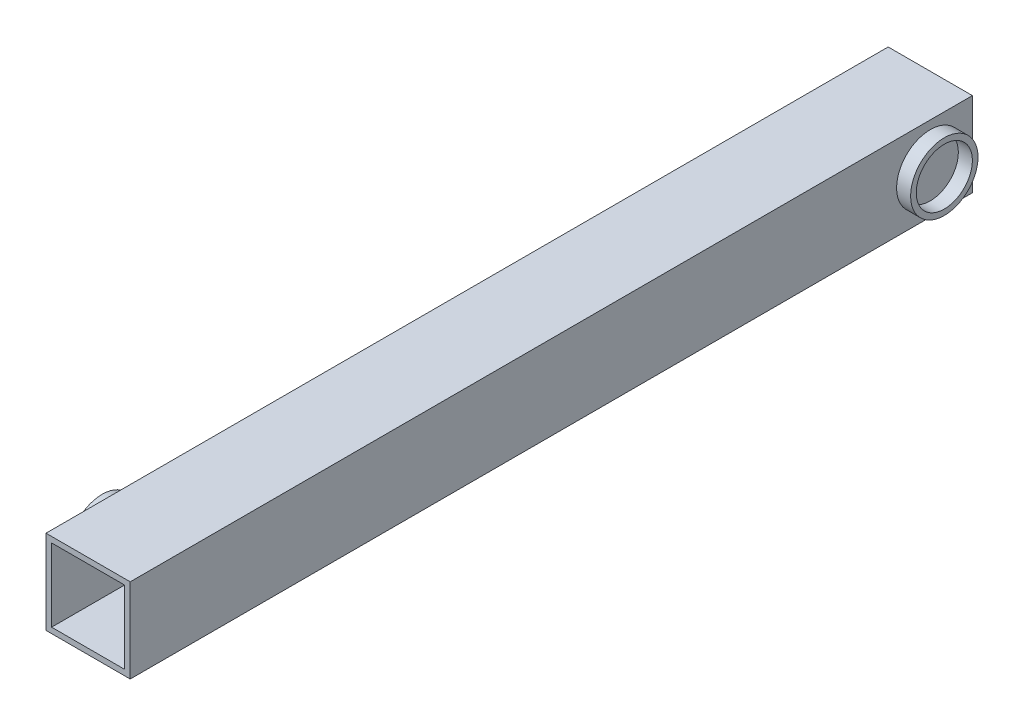
ISO-10303-21;
HEADER;
FILE_DESCRIPTION(('STEP AP214'),'2;1');
FILE_NAME('part.step','',(''),(''),'','','');
FILE_SCHEMA(('AUTOMOTIVE_DESIGN { 1 0 10303 214 1 1 1 1 }'));
ENDSEC;
DATA;
#1=APPLICATION_CONTEXT('core data for automotive mechanical design processes');
#2=APPLICATION_PROTOCOL_DEFINITION('international standard','automotive_design',2000,#1);
#3=PRODUCT_CONTEXT('',#1,'mechanical');
#4=PRODUCT('Part','Part','',(#3));
#5=PRODUCT_RELATED_PRODUCT_CATEGORY('part','',(#4));
#6=PRODUCT_DEFINITION_FORMATION('','',#4);
#7=PRODUCT_DEFINITION_CONTEXT('part definition',#1,'design');
#8=PRODUCT_DEFINITION('design','',#6,#7);
#9=PRODUCT_DEFINITION_SHAPE('','',#8);
#10=(LENGTH_UNIT() NAMED_UNIT(*) SI_UNIT(.MILLI.,.METRE.));
#11=(NAMED_UNIT(*) PLANE_ANGLE_UNIT() SI_UNIT($,.RADIAN.));
#12=(NAMED_UNIT(*) SI_UNIT($,.STERADIAN.) SOLID_ANGLE_UNIT());
#13=UNCERTAINTY_MEASURE_WITH_UNIT(LENGTH_MEASURE(1.E-05),#10,'distance_accuracy_value','');
#14=(GEOMETRIC_REPRESENTATION_CONTEXT(3) GLOBAL_UNCERTAINTY_ASSIGNED_CONTEXT((#13)) GLOBAL_UNIT_ASSIGNED_CONTEXT((#10,
#11,#12)) REPRESENTATION_CONTEXT('',''));
#15=CARTESIAN_POINT('',(0.,0.,0.));
#16=DIRECTION('',(0.,0.,1.));
#17=DIRECTION('',(1.,0.,0.));
#18=AXIS2_PLACEMENT_3D('',#15,#16,#17);
#19=CARTESIAN_POINT('',(0.,0.,300.));
#20=DIRECTION('',(0.,0.,1.));
#21=DIRECTION('',(1.,0.,0.));
#22=AXIS2_PLACEMENT_3D('',#19,#20,#21);
#23=PLANE('',#22);
#24=DIRECTION('',(0.,1.,0.));
#25=VECTOR('',#24,1.);
#26=CARTESIAN_POINT('',(15.,15.,300.));
#27=LINE('',#26,#25);
#28=CARTESIAN_POINT('',(15.,-15.,300.));
#29=VERTEX_POINT('',#28);
#30=CARTESIAN_POINT('',(15.,15.,300.));
#31=VERTEX_POINT('',#30);
#32=EDGE_CURVE('E136',#29,#31,#27,.T.);
#33=ORIENTED_EDGE('',*,*,#32,.T.);
#34=DIRECTION('',(-1.,0.,0.));
#35=VECTOR('',#34,1.);
#36=CARTESIAN_POINT('',(-15.,15.,300.));
#37=LINE('',#36,#35);
#38=CARTESIAN_POINT('',(-15.,15.,300.));
#39=VERTEX_POINT('',#38);
#40=EDGE_CURVE('E139',#31,#39,#37,.T.);
#41=ORIENTED_EDGE('',*,*,#40,.T.);
#42=DIRECTION('',(0.,-1.,0.));
#43=VECTOR('',#42,1.);
#44=CARTESIAN_POINT('',(-15.,15.,300.));
#45=LINE('',#44,#43);
#46=CARTESIAN_POINT('',(-15.,-15.,300.));
#47=VERTEX_POINT('',#46);
#48=EDGE_CURVE('E142',#39,#47,#45,.T.);
#49=ORIENTED_EDGE('',*,*,#48,.T.);
#50=DIRECTION('',(1.,0.,0.));
#51=VECTOR('',#50,1.);
#52=CARTESIAN_POINT('',(-15.,-15.,300.));
#53=LINE('',#52,#51);
#54=EDGE_CURVE('E144',#47,#29,#53,.T.);
#55=ORIENTED_EDGE('',*,*,#54,.T.);
#56=EDGE_LOOP('',(#33,#41,#49,#55));
#57=FACE_BOUND('',#56,.T.);
#58=DIRECTION('',(0.,-1.,0.));
#59=VECTOR('',#58,1.);
#60=CARTESIAN_POINT('',(-13.,13.,300.));
#61=LINE('',#60,#59);
#62=CARTESIAN_POINT('',(-13.,13.,300.));
#63=VERTEX_POINT('',#62);
#64=CARTESIAN_POINT('',(-13.,-13.,300.));
#65=VERTEX_POINT('',#64);
#66=EDGE_CURVE('E106',#63,#65,#61,.T.);
#67=ORIENTED_EDGE('',*,*,#66,.F.);
#68=DIRECTION('',(-1.,0.,0.));
#69=VECTOR('',#68,1.);
#70=CARTESIAN_POINT('',(-13.,13.,300.));
#71=LINE('',#70,#69);
#72=CARTESIAN_POINT('',(13.,13.,300.));
#73=VERTEX_POINT('',#72);
#74=EDGE_CURVE('E98',#73,#63,#71,.T.);
#75=ORIENTED_EDGE('',*,*,#74,.F.);
#76=DIRECTION('',(0.,1.,0.));
#77=VECTOR('',#76,1.);
#78=CARTESIAN_POINT('',(13.,13.,300.));
#79=LINE('',#78,#77);
#80=CARTESIAN_POINT('',(13.,-13.,300.));
#81=VERTEX_POINT('',#80);
#82=EDGE_CURVE('E120',#81,#73,#79,.T.);
#83=ORIENTED_EDGE('',*,*,#82,.F.);
#84=DIRECTION('',(1.,0.,0.));
#85=VECTOR('',#84,1.);
#86=CARTESIAN_POINT('',(-13.,-13.,300.));
#87=LINE('',#86,#85);
#88=EDGE_CURVE('E118',#65,#81,#87,.T.);
#89=ORIENTED_EDGE('',*,*,#88,.F.);
#90=EDGE_LOOP('',(#67,#75,#83,#89));
#91=FACE_BOUND('',#90,.T.);
#92=ADVANCED_FACE('F33',(#57,#91),#23,.T.);
#93=CARTESIAN_POINT('',(0.,0.,0.));
#94=DIRECTION('',(0.,0.,1.));
#95=DIRECTION('',(1.,0.,0.));
#96=AXIS2_PLACEMENT_3D('',#93,#94,#95);
#97=PLANE('',#96);
#98=DIRECTION('',(0.,1.,0.));
#99=VECTOR('',#98,1.);
#100=CARTESIAN_POINT('',(15.,15.,0.));
#101=LINE('',#100,#99);
#102=CARTESIAN_POINT('',(15.,-15.,0.));
#103=VERTEX_POINT('',#102);
#104=CARTESIAN_POINT('',(15.,15.,0.));
#105=VERTEX_POINT('',#104);
#106=EDGE_CURVE('E114',#103,#105,#101,.T.);
#107=ORIENTED_EDGE('',*,*,#106,.F.);
#108=DIRECTION('',(1.,0.,0.));
#109=VECTOR('',#108,1.);
#110=CARTESIAN_POINT('',(-15.,-15.,0.));
#111=LINE('',#110,#109);
#112=CARTESIAN_POINT('',(-15.,-15.,0.));
#113=VERTEX_POINT('',#112);
#114=EDGE_CURVE('E140',#113,#103,#111,.T.);
#115=ORIENTED_EDGE('',*,*,#114,.F.);
#116=DIRECTION('',(0.,-1.,0.));
#117=VECTOR('',#116,1.);
#118=CARTESIAN_POINT('',(-15.,15.,0.));
#119=LINE('',#118,#117);
#120=CARTESIAN_POINT('',(-15.,15.,0.));
#121=VERTEX_POINT('',#120);
#122=EDGE_CURVE('E151',#121,#113,#119,.T.);
#123=ORIENTED_EDGE('',*,*,#122,.F.);
#124=DIRECTION('',(-1.,0.,0.));
#125=VECTOR('',#124,1.);
#126=CARTESIAN_POINT('',(-15.,15.,0.));
#127=LINE('',#126,#125);
#128=EDGE_CURVE('E149',#105,#121,#127,.T.);
#129=ORIENTED_EDGE('',*,*,#128,.F.);
#130=EDGE_LOOP('',(#107,#115,#123,#129));
#131=FACE_BOUND('',#130,.T.);
#132=DIRECTION('',(-1.,0.,0.));
#133=VECTOR('',#132,1.);
#134=CARTESIAN_POINT('',(-13.,13.,0.));
#135=LINE('',#134,#133);
#136=CARTESIAN_POINT('',(13.,13.,0.));
#137=VERTEX_POINT('',#136);
#138=CARTESIAN_POINT('',(-13.,13.,0.));
#139=VERTEX_POINT('',#138);
#140=EDGE_CURVE('E56',#137,#139,#135,.T.);
#141=ORIENTED_EDGE('',*,*,#140,.T.);
#142=DIRECTION('',(0.,-1.,0.));
#143=VECTOR('',#142,1.);
#144=CARTESIAN_POINT('',(-13.,13.,0.));
#145=LINE('',#144,#143);
#146=CARTESIAN_POINT('',(-13.,-13.,0.));
#147=VERTEX_POINT('',#146);
#148=EDGE_CURVE('E113',#139,#147,#145,.T.);
#149=ORIENTED_EDGE('',*,*,#148,.T.);
#150=DIRECTION('',(1.,0.,0.));
#151=VECTOR('',#150,1.);
#152=CARTESIAN_POINT('',(-13.,-13.,0.));
#153=LINE('',#152,#151);
#154=CARTESIAN_POINT('',(13.,-13.,0.));
#155=VERTEX_POINT('',#154);
#156=EDGE_CURVE('E128',#147,#155,#153,.T.);
#157=ORIENTED_EDGE('',*,*,#156,.T.);
#158=DIRECTION('',(0.,1.,0.));
#159=VECTOR('',#158,1.);
#160=CARTESIAN_POINT('',(13.,13.,0.));
#161=LINE('',#160,#159);
#162=EDGE_CURVE('E107',#155,#137,#161,.T.);
#163=ORIENTED_EDGE('',*,*,#162,.T.);
#164=EDGE_LOOP('',(#141,#149,#157,#163));
#165=FACE_BOUND('',#164,.T.);
#166=ADVANCED_FACE('F172',(#131,#165),#97,.F.);
#167=CARTESIAN_POINT('',(15.,15.,300.));
#168=DIRECTION('',(-1.,0.,0.));
#169=DIRECTION('',(0.,0.,1.));
#170=AXIS2_PLACEMENT_3D('',#167,#168,#169);
#171=PLANE('',#170);
#172=CARTESIAN_POINT('',(15.,0.,15.));
#173=DIRECTION('',(-1.,0.,0.));
#174=DIRECTION('',(0.,0.,1.));
#175=AXIS2_PLACEMENT_3D('',#172,#173,#174);
#176=CIRCLE('',#175,12.);
#177=CARTESIAN_POINT('',(15.,0.,27.));
#178=VERTEX_POINT('',#177);
#179=EDGE_CURVE('E41',#178,#178,#176,.F.);
#180=ORIENTED_EDGE('',*,*,#179,.F.);
#181=EDGE_LOOP('',(#180));
#182=FACE_BOUND('',#181,.T.);
#183=ORIENTED_EDGE('',*,*,#106,.T.);
#184=DIRECTION('',(0.,0.,-1.));
#185=VECTOR('',#184,1.);
#186=CARTESIAN_POINT('',(15.,15.,300.));
#187=LINE('',#186,#185);
#188=EDGE_CURVE('E162',#31,#105,#187,.T.);
#189=ORIENTED_EDGE('',*,*,#188,.F.);
#190=ORIENTED_EDGE('',*,*,#32,.F.);
#191=DIRECTION('',(0.,0.,-1.));
#192=VECTOR('',#191,1.);
#193=CARTESIAN_POINT('',(15.,-15.,300.));
#194=LINE('',#193,#192);
#195=EDGE_CURVE('E146',#29,#103,#194,.T.);
#196=ORIENTED_EDGE('',*,*,#195,.T.);
#197=EDGE_LOOP('',(#183,#189,#190,#196));
#198=FACE_BOUND('',#197,.T.);
#199=ADVANCED_FACE('F35',(#182,#198),#171,.F.);
#200=CARTESIAN_POINT('',(-15.,15.,300.));
#201=DIRECTION('',(0.,-1.,0.));
#202=DIRECTION('',(0.,0.,-1.));
#203=AXIS2_PLACEMENT_3D('',#200,#201,#202);
#204=PLANE('',#203);
#205=ORIENTED_EDGE('',*,*,#128,.T.);
#206=DIRECTION('',(0.,0.,-1.));
#207=VECTOR('',#206,1.);
#208=CARTESIAN_POINT('',(-15.,15.,300.));
#209=LINE('',#208,#207);
#210=EDGE_CURVE('E159',#39,#121,#209,.T.);
#211=ORIENTED_EDGE('',*,*,#210,.F.);
#212=ORIENTED_EDGE('',*,*,#40,.F.);
#213=ORIENTED_EDGE('',*,*,#188,.T.);
#214=EDGE_LOOP('',(#205,#211,#212,#213));
#215=FACE_BOUND('',#214,.T.);
#216=ADVANCED_FACE('F171',(#215),#204,.F.);
#217=CARTESIAN_POINT('',(-15.,15.,300.));
#218=DIRECTION('',(1.,0.,0.));
#219=DIRECTION('',(0.,0.,-1.));
#220=AXIS2_PLACEMENT_3D('',#217,#218,#219);
#221=PLANE('',#220);
#222=CARTESIAN_POINT('',(-15.,0.,275.));
#223=DIRECTION('',(1.,0.,0.));
#224=DIRECTION('',(0.,0.,-1.));
#225=AXIS2_PLACEMENT_3D('',#222,#223,#224);
#226=CIRCLE('',#225,12.);
#227=CARTESIAN_POINT('',(-15.,0.,263.));
#228=VERTEX_POINT('',#227);
#229=EDGE_CURVE('E11',#228,#228,#226,.F.);
#230=ORIENTED_EDGE('',*,*,#229,.F.);
#231=EDGE_LOOP('',(#230));
#232=FACE_BOUND('',#231,.T.);
#233=ORIENTED_EDGE('',*,*,#122,.T.);
#234=DIRECTION('',(0.,0.,-1.));
#235=VECTOR('',#234,1.);
#236=CARTESIAN_POINT('',(-15.,-15.,300.));
#237=LINE('',#236,#235);
#238=EDGE_CURVE('E156',#47,#113,#237,.T.);
#239=ORIENTED_EDGE('',*,*,#238,.F.);
#240=ORIENTED_EDGE('',*,*,#48,.F.);
#241=ORIENTED_EDGE('',*,*,#210,.T.);
#242=EDGE_LOOP('',(#233,#239,#240,#241));
#243=FACE_BOUND('',#242,.T.);
#244=ADVANCED_FACE('F191',(#232,#243),#221,.F.);
#245=CARTESIAN_POINT('',(-15.,-15.,300.));
#246=DIRECTION('',(0.,1.,0.));
#247=DIRECTION('',(0.,0.,1.));
#248=AXIS2_PLACEMENT_3D('',#245,#246,#247);
#249=PLANE('',#248);
#250=ORIENTED_EDGE('',*,*,#114,.T.);
#251=ORIENTED_EDGE('',*,*,#195,.F.);
#252=ORIENTED_EDGE('',*,*,#54,.F.);
#253=ORIENTED_EDGE('',*,*,#238,.T.);
#254=EDGE_LOOP('',(#250,#251,#252,#253));
#255=FACE_BOUND('',#254,.T.);
#256=ADVANCED_FACE('F189',(#255),#249,.F.);
#257=CARTESIAN_POINT('',(-13.,13.,300.));
#258=DIRECTION('',(0.,-1.,0.));
#259=DIRECTION('',(0.,0.,-1.));
#260=AXIS2_PLACEMENT_3D('',#257,#258,#259);
#261=PLANE('',#260);
#262=ORIENTED_EDGE('',*,*,#140,.F.);
#263=DIRECTION('',(0.,0.,-1.));
#264=VECTOR('',#263,1.);
#265=CARTESIAN_POINT('',(13.,13.,300.));
#266=LINE('',#265,#264);
#267=EDGE_CURVE('E102',#73,#137,#266,.T.);
#268=ORIENTED_EDGE('',*,*,#267,.F.);
#269=ORIENTED_EDGE('',*,*,#74,.T.);
#270=DIRECTION('',(0.,0.,-1.));
#271=VECTOR('',#270,1.);
#272=CARTESIAN_POINT('',(-13.,13.,300.));
#273=LINE('',#272,#271);
#274=EDGE_CURVE('E101',#63,#139,#273,.T.);
#275=ORIENTED_EDGE('',*,*,#274,.T.);
#276=EDGE_LOOP('',(#262,#268,#269,#275));
#277=FACE_BOUND('',#276,.T.);
#278=ADVANCED_FACE('F100',(#277),#261,.T.);
#279=CARTESIAN_POINT('',(-13.,13.,300.));
#280=DIRECTION('',(1.,0.,0.));
#281=DIRECTION('',(0.,1.,0.));
#282=AXIS2_PLACEMENT_3D('',#279,#280,#281);
#283=PLANE('',#282);
#284=ORIENTED_EDGE('',*,*,#148,.F.);
#285=ORIENTED_EDGE('',*,*,#274,.F.);
#286=ORIENTED_EDGE('',*,*,#66,.T.);
#287=DIRECTION('',(0.,0.,-1.));
#288=VECTOR('',#287,1.);
#289=CARTESIAN_POINT('',(-13.,-13.,300.));
#290=LINE('',#289,#288);
#291=EDGE_CURVE('E115',#65,#147,#290,.T.);
#292=ORIENTED_EDGE('',*,*,#291,.T.);
#293=EDGE_LOOP('',(#284,#285,#286,#292));
#294=FACE_BOUND('',#293,.T.);
#295=ADVANCED_FACE('F110',(#294),#283,.T.);
#296=CARTESIAN_POINT('',(-13.,-13.,300.));
#297=DIRECTION('',(0.,1.,0.));
#298=DIRECTION('',(-1.,0.,0.));
#299=AXIS2_PLACEMENT_3D('',#296,#297,#298);
#300=PLANE('',#299);
#301=ORIENTED_EDGE('',*,*,#156,.F.);
#302=ORIENTED_EDGE('',*,*,#291,.F.);
#303=ORIENTED_EDGE('',*,*,#88,.T.);
#304=DIRECTION('',(0.,0.,-1.));
#305=VECTOR('',#304,1.);
#306=CARTESIAN_POINT('',(13.,-13.,300.));
#307=LINE('',#306,#305);
#308=EDGE_CURVE('E48',#81,#155,#307,.T.);
#309=ORIENTED_EDGE('',*,*,#308,.T.);
#310=EDGE_LOOP('',(#301,#302,#303,#309));
#311=FACE_BOUND('',#310,.T.);
#312=ADVANCED_FACE('F216',(#311),#300,.T.);
#313=CARTESIAN_POINT('',(13.,13.,300.));
#314=DIRECTION('',(-1.,0.,0.));
#315=DIRECTION('',(0.,-1.,0.));
#316=AXIS2_PLACEMENT_3D('',#313,#314,#315);
#317=PLANE('',#316);
#318=ORIENTED_EDGE('',*,*,#162,.F.);
#319=ORIENTED_EDGE('',*,*,#308,.F.);
#320=ORIENTED_EDGE('',*,*,#82,.T.);
#321=ORIENTED_EDGE('',*,*,#267,.T.);
#322=EDGE_LOOP('',(#318,#319,#320,#321));
#323=FACE_BOUND('',#322,.T.);
#324=ADVANCED_FACE('F219',(#323),#317,.T.);
#325=CARTESIAN_POINT('',(20.,0.,15.));
#326=DIRECTION('',(1.,0.,0.));
#327=DIRECTION('',(0.,0.,-1.));
#328=AXIS2_PLACEMENT_3D('',#325,#326,#327);
#329=PLANE('',#328);
#330=CARTESIAN_POINT('',(20.,0.,15.));
#331=DIRECTION('',(1.,0.,0.));
#332=DIRECTION('',(0.,0.,-1.));
#333=AXIS2_PLACEMENT_3D('',#330,#331,#332);
#334=CIRCLE('',#333,12.);
#335=CARTESIAN_POINT('',(20.,0.,3.));
#336=VERTEX_POINT('',#335);
#337=EDGE_CURVE('E126',#336,#336,#334,.T.);
#338=ORIENTED_EDGE('',*,*,#337,.T.);
#339=EDGE_LOOP('',(#338));
#340=FACE_BOUND('',#339,.T.);
#341=CARTESIAN_POINT('',(20.,0.,15.));
#342=DIRECTION('',(1.,0.,0.));
#343=DIRECTION('',(0.,0.,-1.));
#344=AXIS2_PLACEMENT_3D('',#341,#342,#343);
#345=CIRCLE('',#344,10.);
#346=CARTESIAN_POINT('',(20.,0.,5.));
#347=VERTEX_POINT('',#346);
#348=EDGE_CURVE('E260',#347,#347,#345,.T.);
#349=ORIENTED_EDGE('',*,*,#348,.F.);
#350=EDGE_LOOP('',(#349));
#351=FACE_BOUND('',#350,.T.);
#352=ADVANCED_FACE('F223',(#340,#351),#329,.T.);
#353=CARTESIAN_POINT('',(20.,0.,15.));
#354=DIRECTION('',(-1.,0.,0.));
#355=DIRECTION('',(0.,0.,1.));
#356=AXIS2_PLACEMENT_3D('',#353,#354,#355);
#357=CYLINDRICAL_SURFACE('',#356,12.);
#358=ORIENTED_EDGE('',*,*,#337,.F.);
#359=EDGE_LOOP('',(#358));
#360=FACE_BOUND('',#359,.T.);
#361=ORIENTED_EDGE('',*,*,#179,.T.);
#362=EDGE_LOOP('',(#361));
#363=FACE_BOUND('',#362,.T.);
#364=ADVANCED_FACE('F167',(#360,#363),#357,.T.);
#365=CARTESIAN_POINT('',(20.,0.,15.));
#366=DIRECTION('',(-1.,0.,0.));
#367=DIRECTION('',(0.,0.,1.));
#368=AXIS2_PLACEMENT_3D('',#365,#366,#367);
#369=CYLINDRICAL_SURFACE('',#368,10.);
#370=ORIENTED_EDGE('',*,*,#348,.T.);
#371=EDGE_LOOP('',(#370));
#372=FACE_BOUND('',#371,.T.);
#373=CARTESIAN_POINT('',(15.,0.,15.));
#374=DIRECTION('',(1.,0.,0.));
#375=DIRECTION('',(0.,0.,-1.));
#376=AXIS2_PLACEMENT_3D('',#373,#374,#375);
#377=CIRCLE('',#376,10.);
#378=CARTESIAN_POINT('',(15.,0.,5.));
#379=VERTEX_POINT('',#378);
#380=EDGE_CURVE('E259',#379,#379,#377,.T.);
#381=ORIENTED_EDGE('',*,*,#380,.F.);
#382=EDGE_LOOP('',(#381));
#383=FACE_BOUND('',#382,.T.);
#384=ADVANCED_FACE('F226',(#372,#383),#369,.F.);
#385=ORIENTED_EDGE('',*,*,#380,.T.);
#386=EDGE_LOOP('',(#385));
#387=FACE_BOUND('',#386,.T.);
#388=ADVANCED_FACE('F173',(#387),#171,.F.);
#389=CARTESIAN_POINT('',(-20.,0.,275.));
#390=DIRECTION('',(-1.,0.,0.));
#391=DIRECTION('',(0.,0.,1.));
#392=AXIS2_PLACEMENT_3D('',#389,#390,#391);
#393=PLANE('',#392);
#394=CARTESIAN_POINT('',(-20.,0.,275.));
#395=DIRECTION('',(-1.,0.,0.));
#396=DIRECTION('',(0.,0.,1.));
#397=AXIS2_PLACEMENT_3D('',#394,#395,#396);
#398=CIRCLE('',#397,12.);
#399=CARTESIAN_POINT('',(-20.,0.,287.));
#400=VERTEX_POINT('',#399);
#401=EDGE_CURVE('E254',#400,#400,#398,.T.);
#402=ORIENTED_EDGE('',*,*,#401,.T.);
#403=EDGE_LOOP('',(#402));
#404=FACE_BOUND('',#403,.T.);
#405=CARTESIAN_POINT('',(-20.,0.,275.));
#406=DIRECTION('',(-1.,0.,0.));
#407=DIRECTION('',(0.,0.,1.));
#408=AXIS2_PLACEMENT_3D('',#405,#406,#407);
#409=CIRCLE('',#408,9.99999999999998);
#410=CARTESIAN_POINT('',(-20.,0.,285.));
#411=VERTEX_POINT('',#410);
#412=EDGE_CURVE('E249',#411,#411,#409,.T.);
#413=ORIENTED_EDGE('',*,*,#412,.F.);
#414=EDGE_LOOP('',(#413));
#415=FACE_BOUND('',#414,.T.);
#416=ADVANCED_FACE('F237',(#404,#415),#393,.T.);
#417=CARTESIAN_POINT('',(-20.,0.,275.));
#418=DIRECTION('',(1.,0.,0.));
#419=DIRECTION('',(0.,0.,-1.));
#420=AXIS2_PLACEMENT_3D('',#417,#418,#419);
#421=CYLINDRICAL_SURFACE('',#420,12.);
#422=ORIENTED_EDGE('',*,*,#401,.F.);
#423=EDGE_LOOP('',(#422));
#424=FACE_BOUND('',#423,.T.);
#425=ORIENTED_EDGE('',*,*,#229,.T.);
#426=EDGE_LOOP('',(#425));
#427=FACE_BOUND('',#426,.T.);
#428=ADVANCED_FACE('F234',(#424,#427),#421,.T.);
#429=CARTESIAN_POINT('',(-20.,0.,275.));
#430=DIRECTION('',(1.,0.,0.));
#431=DIRECTION('',(0.,0.,-1.));
#432=AXIS2_PLACEMENT_3D('',#429,#430,#431);
#433=CYLINDRICAL_SURFACE('',#432,9.99999999999998);
#434=ORIENTED_EDGE('',*,*,#412,.T.);
#435=EDGE_LOOP('',(#434));
#436=FACE_BOUND('',#435,.T.);
#437=CARTESIAN_POINT('',(-15.,0.,275.));
#438=DIRECTION('',(-1.,0.,0.));
#439=DIRECTION('',(0.,0.,1.));
#440=AXIS2_PLACEMENT_3D('',#437,#438,#439);
#441=CIRCLE('',#440,9.99999999999998);
#442=CARTESIAN_POINT('',(-15.,0.,285.));
#443=VERTEX_POINT('',#442);
#444=EDGE_CURVE('E252',#443,#443,#441,.T.);
#445=ORIENTED_EDGE('',*,*,#444,.F.);
#446=EDGE_LOOP('',(#445));
#447=FACE_BOUND('',#446,.T.);
#448=ADVANCED_FACE('F203',(#436,#447),#433,.F.);
#449=ORIENTED_EDGE('',*,*,#444,.T.);
#450=EDGE_LOOP('',(#449));
#451=FACE_BOUND('',#450,.T.);
#452=ADVANCED_FACE('F195',(#451),#221,.F.);
#453=CLOSED_SHELL('',(#92,#166,#199,#216,#244,#256,#278,#295,#312,#324,#352,#364,#384,#388,#416,
#428,#448,#452));
#454=MANIFOLD_SOLID_BREP('B2',#453);
#455=ADVANCED_BREP_SHAPE_REPRESENTATION('',(#18,#454),#14);
#456=SHAPE_DEFINITION_REPRESENTATION(#9,#455);
ENDSEC;
END-ISO-10303-21;
